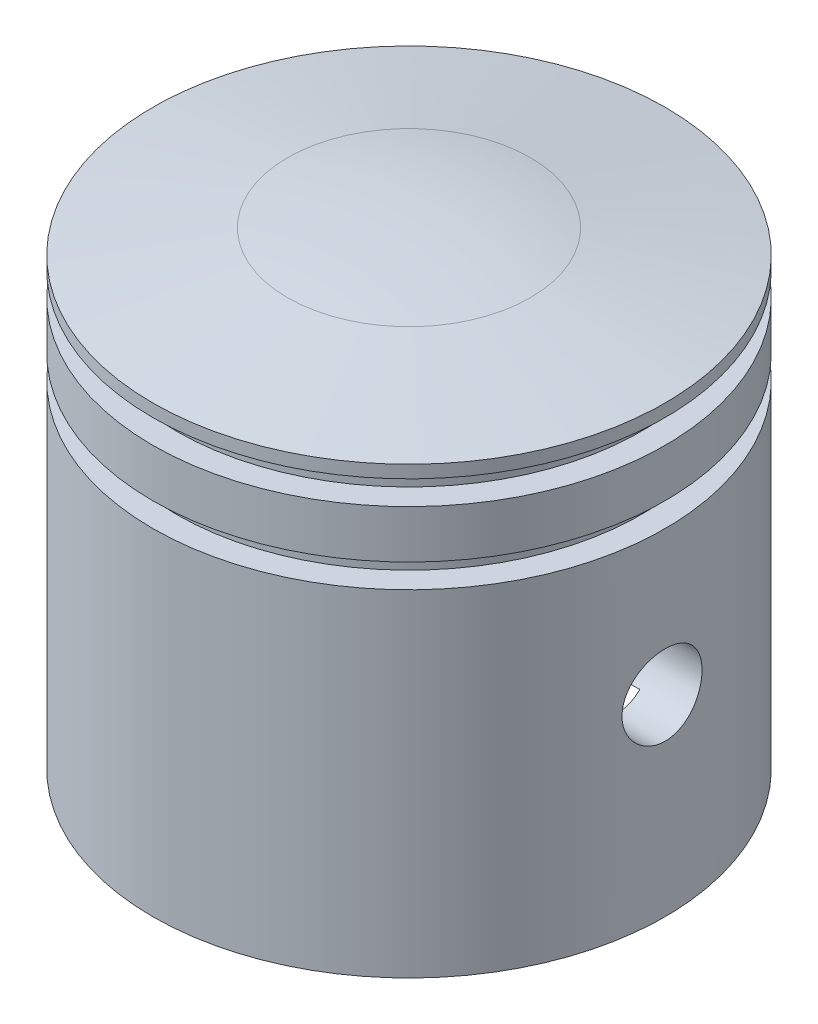
ISO-10303-21;
HEADER;
FILE_DESCRIPTION(('STEP AP214'),'2;1');
FILE_NAME('part.step','',(''),(''),'','','');
FILE_SCHEMA(('AUTOMOTIVE_DESIGN { 1 0 10303 214 1 1 1 1 }'));
ENDSEC;
DATA;
#1=APPLICATION_CONTEXT('core data for automotive mechanical design processes');
#2=APPLICATION_PROTOCOL_DEFINITION('international standard','automotive_design',2000,#1);
#3=PRODUCT_CONTEXT('',#1,'mechanical');
#4=PRODUCT('Part','Part','',(#3));
#5=PRODUCT_RELATED_PRODUCT_CATEGORY('part','',(#4));
#6=PRODUCT_DEFINITION_FORMATION('','',#4);
#7=PRODUCT_DEFINITION_CONTEXT('part definition',#1,'design');
#8=PRODUCT_DEFINITION('design','',#6,#7);
#9=PRODUCT_DEFINITION_SHAPE('','',#8);
#10=(LENGTH_UNIT() NAMED_UNIT(*) SI_UNIT(.MILLI.,.METRE.));
#11=(NAMED_UNIT(*) PLANE_ANGLE_UNIT() SI_UNIT($,.RADIAN.));
#12=(NAMED_UNIT(*) SI_UNIT($,.STERADIAN.) SOLID_ANGLE_UNIT());
#13=UNCERTAINTY_MEASURE_WITH_UNIT(LENGTH_MEASURE(1.E-05),#10,'distance_accuracy_value','');
#14=(GEOMETRIC_REPRESENTATION_CONTEXT(3) GLOBAL_UNCERTAINTY_ASSIGNED_CONTEXT((#13)) GLOBAL_UNIT_ASSIGNED_CONTEXT((#10,
#11,#12)) REPRESENTATION_CONTEXT('',''));
#15=CARTESIAN_POINT('',(0.,0.,0.));
#16=DIRECTION('',(0.,0.,1.));
#17=DIRECTION('',(1.,0.,0.));
#18=AXIS2_PLACEMENT_3D('',#15,#16,#17);
#19=CARTESIAN_POINT('',(0.,10.,0.));
#20=DIRECTION('',(0.,-1.,0.));
#21=DIRECTION('',(0.,0.,-1.));
#22=AXIS2_PLACEMENT_3D('',#19,#20,#21);
#23=PLANE('',#22);
#24=DIRECTION('',(1.,0.,0.));
#25=VECTOR('',#24,1.);
#26=CARTESIAN_POINT('',(-16.,10.,-1.5));
#27=LINE('',#26,#25);
#28=CARTESIAN_POINT('',(-12.913171570145,10.,-1.5));
#29=VERTEX_POINT('',#28);
#30=CARTESIAN_POINT('',(-9.88685996664259,10.,-1.5));
#31=VERTEX_POINT('',#30);
#32=EDGE_CURVE('E74',#29,#31,#27,.T.);
#33=ORIENTED_EDGE('',*,*,#32,.F.);
#34=CARTESIAN_POINT('',(0.,10.,0.));
#35=DIRECTION('',(0.,-1.,0.));
#36=DIRECTION('',(0.,0.,-1.));
#37=AXIS2_PLACEMENT_3D('',#34,#35,#36);
#38=CIRCLE('',#37,13.);
#39=CARTESIAN_POINT('',(12.913171570145,10.,-1.5));
#40=VERTEX_POINT('',#39);
#41=EDGE_CURVE('E277',#29,#40,#38,.T.);
#42=ORIENTED_EDGE('',*,*,#41,.T.);
#43=CARTESIAN_POINT('',(9.88685996664259,10.,-1.5));
#44=VERTEX_POINT('',#43);
#45=EDGE_CURVE('E283',#44,#40,#27,.T.);
#46=ORIENTED_EDGE('',*,*,#45,.F.);
#47=CARTESIAN_POINT('',(0.,10.,0.));
#48=DIRECTION('',(0.,-1.,0.));
#49=DIRECTION('',(0.,0.,-1.));
#50=AXIS2_PLACEMENT_3D('',#47,#48,#49);
#51=CIRCLE('',#50,10.);
#52=EDGE_CURVE('E112',#44,#31,#51,.F.);
#53=ORIENTED_EDGE('',*,*,#52,.T.);
#54=EDGE_LOOP('',(#33,#42,#46,#53));
#55=FACE_BOUND('',#54,.T.);
#56=ADVANCED_FACE('F45',(#55),#23,.T.);
#57=CARTESIAN_POINT('',(0.,30.,0.));
#58=DIRECTION('',(0.,1.,0.));
#59=DIRECTION('',(0.,0.,1.));
#60=AXIS2_PLACEMENT_3D('',#57,#58,#59);
#61=CYLINDRICAL_SURFACE('',#60,16.);
#62=CARTESIAN_POINT('',(0.,27.,0.));
#63=DIRECTION('',(0.,1.,0.));
#64=DIRECTION('',(0.,0.,1.));
#65=AXIS2_PLACEMENT_3D('',#62,#63,#64);
#66=CIRCLE('',#65,16.);
#67=CARTESIAN_POINT('',(0.,27.,16.));
#68=VERTEX_POINT('',#67);
#69=EDGE_CURVE('E244',#68,#68,#66,.T.);
#70=ORIENTED_EDGE('',*,*,#69,.T.);
#71=EDGE_LOOP('',(#70));
#72=FACE_BOUND('',#71,.T.);
#73=CARTESIAN_POINT('',(0.,27.790539738545,0.));
#74=DIRECTION('',(0.,1.,0.));
#75=DIRECTION('',(0.,0.,1.));
#76=AXIS2_PLACEMENT_3D('',#73,#74,#75);
#77=CIRCLE('',#76,16.);
#78=CARTESIAN_POINT('',(0.,27.790539738545,16.));
#79=VERTEX_POINT('',#78);
#80=EDGE_CURVE('E258',#79,#79,#77,.T.);
#81=ORIENTED_EDGE('',*,*,#80,.F.);
#82=EDGE_LOOP('',(#81));
#83=FACE_BOUND('',#82,.T.);
#84=ADVANCED_FACE('F165',(#72,#83),#61,.T.);
#85=CARTESIAN_POINT('',(0.,27.790539738545,0.));
#86=DIRECTION('',(0.,-1.,0.));
#87=DIRECTION('',(0.,0.,-1.));
#88=AXIS2_PLACEMENT_3D('',#85,#86,#87);
#89=CONICAL_SURFACE('',#88,16.,1.39626340159547);
#90=CARTESIAN_POINT('',(0.,29.275044666626,0.));
#91=DIRECTION('',(0.,1.,0.));
#92=DIRECTION('',(0.,0.,1.));
#93=AXIS2_PLACEMENT_3D('',#90,#91,#92);
#94=CIRCLE('',#93,7.58095419024099);
#95=CARTESIAN_POINT('',(0.,29.275044666626,7.58095419024099));
#96=VERTEX_POINT('',#95);
#97=EDGE_CURVE('E255',#96,#96,#94,.T.);
#98=ORIENTED_EDGE('',*,*,#97,.F.);
#99=EDGE_LOOP('',(#98));
#100=FACE_BOUND('',#99,.T.);
#101=ORIENTED_EDGE('',*,*,#80,.T.);
#102=EDGE_LOOP('',(#101));
#103=FACE_BOUND('',#102,.T.);
#104=ADVANCED_FACE('F169',(#100,#103),#89,.T.);
#105=CARTESIAN_POINT('',(0.,-10.,0.));
#106=DIRECTION('',(0.,1.,0.));
#107=DIRECTION('',(1.,0.,0.));
#108=AXIS2_PLACEMENT_3D('',#105,#106,#107);
#109=SPHERICAL_SURFACE('',#108,40.);
#110=ORIENTED_EDGE('',*,*,#97,.T.);
#111=EDGE_LOOP('',(#110));
#112=FACE_BOUND('',#111,.T.);
#113=ADVANCED_FACE('F176',(#112),#109,.T.);
#114=CARTESIAN_POINT('',(14.5,25.5,0.));
#115=DIRECTION('',(0.,-1.,0.));
#116=DIRECTION('',(0.,0.,-1.));
#117=AXIS2_PLACEMENT_3D('',#114,#115,#116);
#118=PLANE('',#117);
#119=CARTESIAN_POINT('',(0.,25.5,0.));
#120=DIRECTION('',(0.,-1.,0.));
#121=DIRECTION('',(0.,0.,-1.));
#122=AXIS2_PLACEMENT_3D('',#119,#120,#121);
#123=CIRCLE('',#122,14.5);
#124=CARTESIAN_POINT('',(0.,25.5,-14.5));
#125=VERTEX_POINT('',#124);
#126=EDGE_CURVE('E239',#125,#125,#123,.T.);
#127=ORIENTED_EDGE('',*,*,#126,.T.);
#128=EDGE_LOOP('',(#127));
#129=FACE_BOUND('',#128,.T.);
#130=CARTESIAN_POINT('',(0.,25.5,0.));
#131=DIRECTION('',(0.,-1.,0.));
#132=DIRECTION('',(0.,0.,-1.));
#133=AXIS2_PLACEMENT_3D('',#130,#131,#132);
#134=CIRCLE('',#133,16.);
#135=CARTESIAN_POINT('',(0.,25.5,-16.));
#136=VERTEX_POINT('',#135);
#137=EDGE_CURVE('E120',#136,#136,#134,.T.);
#138=ORIENTED_EDGE('',*,*,#137,.F.);
#139=EDGE_LOOP('',(#138));
#140=FACE_BOUND('',#139,.T.);
#141=ADVANCED_FACE('F180',(#129,#140),#118,.F.);
#142=CARTESIAN_POINT('',(14.5,27.,0.));
#143=DIRECTION('',(0.,1.,0.));
#144=DIRECTION('',(0.,0.,1.));
#145=AXIS2_PLACEMENT_3D('',#142,#143,#144);
#146=PLANE('',#145);
#147=CARTESIAN_POINT('',(0.,27.,0.));
#148=DIRECTION('',(0.,-1.,0.));
#149=DIRECTION('',(0.,0.,-1.));
#150=AXIS2_PLACEMENT_3D('',#147,#148,#149);
#151=CIRCLE('',#150,14.5);
#152=CARTESIAN_POINT('',(0.,27.,-14.5));
#153=VERTEX_POINT('',#152);
#154=EDGE_CURVE('E247',#153,#153,#151,.T.);
#155=ORIENTED_EDGE('',*,*,#154,.F.);
#156=EDGE_LOOP('',(#155));
#157=FACE_BOUND('',#156,.T.);
#158=ORIENTED_EDGE('',*,*,#69,.F.);
#159=EDGE_LOOP('',(#158));
#160=FACE_BOUND('',#159,.T.);
#161=ADVANCED_FACE('F197',(#157,#160),#146,.F.);
#162=CARTESIAN_POINT('',(0.,0.,0.));
#163=DIRECTION('',(0.,-1.,0.));
#164=DIRECTION('',(0.,0.,-1.));
#165=AXIS2_PLACEMENT_3D('',#162,#163,#164);
#166=CYLINDRICAL_SURFACE('',#165,14.5);
#167=ORIENTED_EDGE('',*,*,#126,.F.);
#168=EDGE_LOOP('',(#167));
#169=FACE_BOUND('',#168,.T.);
#170=ORIENTED_EDGE('',*,*,#154,.T.);
#171=EDGE_LOOP('',(#170));
#172=FACE_BOUND('',#171,.T.);
#173=ADVANCED_FACE('F194',(#169,#172),#166,.T.);
#174=ORIENTED_EDGE('',*,*,#137,.T.);
#175=EDGE_LOOP('',(#174));
#176=FACE_BOUND('',#175,.T.);
#177=CARTESIAN_POINT('',(0.,22.5,0.));
#178=DIRECTION('',(0.,1.,0.));
#179=DIRECTION('',(0.,0.,1.));
#180=AXIS2_PLACEMENT_3D('',#177,#178,#179);
#181=CIRCLE('',#180,16.);
#182=CARTESIAN_POINT('',(0.,22.5,16.));
#183=VERTEX_POINT('',#182);
#184=EDGE_CURVE('E235',#183,#183,#181,.T.);
#185=ORIENTED_EDGE('',*,*,#184,.T.);
#186=EDGE_LOOP('',(#185));
#187=FACE_BOUND('',#186,.T.);
#188=ADVANCED_FACE('F171',(#176,#187),#61,.T.);
#189=CARTESIAN_POINT('',(14.5,21.,0.));
#190=DIRECTION('',(0.,-1.,0.));
#191=DIRECTION('',(0.,0.,-1.));
#192=AXIS2_PLACEMENT_3D('',#189,#190,#191);
#193=PLANE('',#192);
#194=CARTESIAN_POINT('',(0.,21.,0.));
#195=DIRECTION('',(0.,-1.,0.));
#196=DIRECTION('',(0.,0.,-1.));
#197=AXIS2_PLACEMENT_3D('',#194,#195,#196);
#198=CIRCLE('',#197,14.5);
#199=CARTESIAN_POINT('',(0.,21.,-14.5));
#200=VERTEX_POINT('',#199);
#201=EDGE_CURVE('E264',#200,#200,#198,.T.);
#202=ORIENTED_EDGE('',*,*,#201,.T.);
#203=EDGE_LOOP('',(#202));
#204=FACE_BOUND('',#203,.T.);
#205=CARTESIAN_POINT('',(0.,21.,0.));
#206=DIRECTION('',(0.,-1.,0.));
#207=DIRECTION('',(0.,0.,-1.));
#208=AXIS2_PLACEMENT_3D('',#205,#206,#207);
#209=CIRCLE('',#208,16.);
#210=CARTESIAN_POINT('',(0.,21.,-16.));
#211=VERTEX_POINT('',#210);
#212=EDGE_CURVE('E238',#211,#211,#209,.T.);
#213=ORIENTED_EDGE('',*,*,#212,.F.);
#214=EDGE_LOOP('',(#213));
#215=FACE_BOUND('',#214,.T.);
#216=ADVANCED_FACE('F187',(#204,#215),#193,.F.);
#217=CARTESIAN_POINT('',(14.5,22.5,0.));
#218=DIRECTION('',(0.,1.,0.));
#219=DIRECTION('',(0.,0.,1.));
#220=AXIS2_PLACEMENT_3D('',#217,#218,#219);
#221=PLANE('',#220);
#222=CARTESIAN_POINT('',(0.,22.5,0.));
#223=DIRECTION('',(0.,-1.,0.));
#224=DIRECTION('',(0.,0.,-1.));
#225=AXIS2_PLACEMENT_3D('',#222,#223,#224);
#226=CIRCLE('',#225,14.5);
#227=CARTESIAN_POINT('',(0.,22.5,-14.5));
#228=VERTEX_POINT('',#227);
#229=EDGE_CURVE('E117',#228,#228,#226,.T.);
#230=ORIENTED_EDGE('',*,*,#229,.F.);
#231=EDGE_LOOP('',(#230));
#232=FACE_BOUND('',#231,.T.);
#233=ORIENTED_EDGE('',*,*,#184,.F.);
#234=EDGE_LOOP('',(#233));
#235=FACE_BOUND('',#234,.T.);
#236=ADVANCED_FACE('F185',(#232,#235),#221,.F.);
#237=CARTESIAN_POINT('',(0.,0.,0.));
#238=DIRECTION('',(0.,-1.,0.));
#239=DIRECTION('',(0.,0.,-1.));
#240=AXIS2_PLACEMENT_3D('',#237,#238,#239);
#241=CYLINDRICAL_SURFACE('',#240,14.5);
#242=ORIENTED_EDGE('',*,*,#201,.F.);
#243=EDGE_LOOP('',(#242));
#244=FACE_BOUND('',#243,.T.);
#245=ORIENTED_EDGE('',*,*,#229,.T.);
#246=EDGE_LOOP('',(#245));
#247=FACE_BOUND('',#246,.T.);
#248=ADVANCED_FACE('F182',(#244,#247),#241,.T.);
#249=CARTESIAN_POINT('',(0.,0.,0.));
#250=DIRECTION('',(0.,1.,0.));
#251=DIRECTION('',(0.,0.,1.));
#252=AXIS2_PLACEMENT_3D('',#249,#250,#251);
#253=PLANE('',#252);
#254=CARTESIAN_POINT('',(0.,0.,0.));
#255=DIRECTION('',(0.,-1.,0.));
#256=DIRECTION('',(0.,0.,-1.));
#257=AXIS2_PLACEMENT_3D('',#254,#255,#256);
#258=CIRCLE('',#257,13.);
#259=CARTESIAN_POINT('',(0.,0.,-13.));
#260=VERTEX_POINT('',#259);
#261=EDGE_CURVE('E274',#260,#260,#258,.T.);
#262=ORIENTED_EDGE('',*,*,#261,.F.);
#263=EDGE_LOOP('',(#262));
#264=FACE_BOUND('',#263,.T.);
#265=CARTESIAN_POINT('',(0.,0.,0.));
#266=DIRECTION('',(0.,1.,0.));
#267=DIRECTION('',(0.,0.,1.));
#268=AXIS2_PLACEMENT_3D('',#265,#266,#267);
#269=CIRCLE('',#268,16.);
#270=CARTESIAN_POINT('',(0.,0.,16.));
#271=VERTEX_POINT('',#270);
#272=EDGE_CURVE('E99',#271,#271,#269,.T.);
#273=ORIENTED_EDGE('',*,*,#272,.F.);
#274=EDGE_LOOP('',(#273));
#275=FACE_BOUND('',#274,.T.);
#276=ADVANCED_FACE('F47',(#264,#275),#253,.F.);
#277=CARTESIAN_POINT('',(-16.,14.5,0.));
#278=CARTESIAN_POINT('',(-15.9999977019448,14.4999943017285,0.139515097271033));
#279=CARTESIAN_POINT('',(-15.9981561248574,14.4882818862264,0.279109404865704));
#280=CARTESIAN_POINT('',(-15.9909869809759,14.4417563087232,0.554391314978102));
#281=CARTESIAN_POINT('',(-15.9856560884472,14.4069211074965,0.690075061323317));
#282=CARTESIAN_POINT('',(-15.9721069716578,14.3152203371934,0.953512538047404));
#283=CARTESIAN_POINT('',(-15.9638909956317,14.2583719186384,1.0812723522899));
#284=CARTESIAN_POINT('',(-15.9454779403815,14.1243014548584,1.3254212510446));
#285=CARTESIAN_POINT('',(-15.9352811186255,14.0470820569641,1.44181181036831));
#286=CARTESIAN_POINT('',(-15.9139426841436,13.873766951646,1.66091991165162));
#287=CARTESIAN_POINT('',(-15.9027945139234,13.7775330051098,1.76352747914264));
#288=CARTESIAN_POINT('',(-15.8808607613029,13.5692180517311,1.95120768822823));
#289=CARTESIAN_POINT('',(-15.8700752005075,13.4571361026998,2.03627928654192));
#290=CARTESIAN_POINT('',(-15.8500242812744,13.2195617286563,2.18690544328884));
#291=CARTESIAN_POINT('',(-15.840767397861,13.0940005176382,2.25235273557992));
#292=CARTESIAN_POINT('',(-15.8249120174236,12.8334985891422,2.36118681597065));
#293=CARTESIAN_POINT('',(-15.8183133630222,12.6985584274894,2.40457491010063));
#294=CARTESIAN_POINT('',(-15.8085863451104,12.4242890988562,2.46771559322167));
#295=CARTESIAN_POINT('',(-15.8054302653236,12.2850044141812,2.48765705487496));
#296=CARTESIAN_POINT('',(-15.8028617107177,12.0050328111074,2.50392369757622));
#297=CARTESIAN_POINT('',(-15.8034490028802,11.864345980534,2.50025034860466));
#298=CARTESIAN_POINT('',(-15.8082755045521,11.5869029681473,2.4695458080889));
#299=CARTESIAN_POINT('',(-15.8124817218495,11.4501227766469,2.44272562959693));
#300=CARTESIAN_POINT('',(-15.8240205634547,11.1830279936407,2.36681937833752));
#301=CARTESIAN_POINT('',(-15.8313532830641,11.0527135993595,2.31773262684132));
#302=CARTESIAN_POINT('',(-15.8483550685462,10.8016112873228,2.19846916949384));
#303=CARTESIAN_POINT('',(-15.8580339308724,10.6808662082269,2.12820372315549));
#304=CARTESIAN_POINT('',(-15.878630461501,10.4528004643145,1.96864058146637));
#305=CARTESIAN_POINT('',(-15.8895482178821,10.3454807551125,1.87934153253017));
#306=CARTESIAN_POINT('',(-15.911537862489,10.1460897533667,1.68309088822333));
#307=CARTESIAN_POINT('',(-15.9226101363559,10.0541968417305,1.57595800560539));
#308=CARTESIAN_POINT('',(-15.9435512534783,9.8896668543601,1.34769694737936));
#309=CARTESIAN_POINT('',(-15.9534200906202,9.81702987644317,1.22656870068132));
#310=CARTESIAN_POINT('',(-15.9708539902704,9.69306192657761,0.973595927056491));
#311=CARTESIAN_POINT('',(-15.9784174854193,9.641745441467,0.841744186240459));
#312=CARTESIAN_POINT('',(-15.9903756000068,9.56203403255277,0.571149534696758));
#313=CARTESIAN_POINT('',(-15.9947704520898,9.53363742593352,0.4324071306872));
#314=CARTESIAN_POINT('',(-15.9998651172728,9.50081072354981,0.153508336763735));
#315=CARTESIAN_POINT('',(-16.0006027179286,9.49613552102382,0.013381461508702));
#316=CARTESIAN_POINT('',(-15.9984028649127,9.51023270533598,-0.265654546411642));
#317=CARTESIAN_POINT('',(-15.9954655349964,9.52900430258911,-0.404563719925156));
#318=CARTESIAN_POINT('',(-15.9862692369322,9.58925838768018,-0.676473446265705));
#319=CARTESIAN_POINT('',(-15.9800278421539,9.63062075826773,-0.809501262056041));
#320=CARTESIAN_POINT('',(-15.9649207568356,9.73475509439879,-1.06673406785663));
#321=CARTESIAN_POINT('',(-15.9560549341007,9.79752813844267,-1.19093861303941));
#322=CARTESIAN_POINT('',(-15.9365897274094,9.94327199112658,-1.42807220225041));
#323=CARTESIAN_POINT('',(-15.9259772866342,10.0263974200905,-1.54090512378373));
#324=CARTESIAN_POINT('',(-15.9042388046444,10.2102720859078,-1.75110696507806));
#325=CARTESIAN_POINT('',(-15.8931127309268,10.3110224392049,-1.84847490447018));
#326=CARTESIAN_POINT('',(-15.8714802753665,10.5283811972172,-2.02588080776691));
#327=CARTESIAN_POINT('',(-15.860980411908,10.6451248471223,-2.10575398584126));
#328=CARTESIAN_POINT('',(-15.8419069280583,10.8905160736613,-2.2447556772664));
#329=CARTESIAN_POINT('',(-15.83333325222,11.0191633074895,-2.30388478778105));
#330=CARTESIAN_POINT('',(-15.8191307135236,11.2842296407142,-2.39946771944995));
#331=CARTESIAN_POINT('',(-15.8134908234896,11.4206174687656,-2.43600654947912));
#332=CARTESIAN_POINT('',(-15.8057657028079,11.697689143664,-2.48564122040535));
#333=CARTESIAN_POINT('',(-15.8036802038444,11.838372665419,-2.49873883084997));
#334=CARTESIAN_POINT('',(-15.8033105804488,12.1183987159075,-2.50107452690756));
#335=CARTESIAN_POINT('',(-15.804985160429,12.2577390969335,-2.49057180548425));
#336=CARTESIAN_POINT('',(-15.8118569894183,12.5326452971443,-2.44656223255901));
#337=CARTESIAN_POINT('',(-15.8170542307995,12.6682111245017,-2.41305543086961));
#338=CARTESIAN_POINT('',(-15.830370888549,12.9316378266405,-2.32408329891852));
#339=CARTESIAN_POINT('',(-15.8384876895341,13.0595054782584,-2.26863761738581));
#340=CARTESIAN_POINT('',(-15.856731840474,13.3041656136763,-2.13738768546417));
#341=CARTESIAN_POINT('',(-15.8668592701083,13.4209576582884,-2.06158262820886));
#342=CARTESIAN_POINT('',(-15.8881156809226,13.6414655441268,-1.8908300813908));
#343=CARTESIAN_POINT('',(-15.8992540116029,13.7450321966138,-1.79569107094768));
#344=CARTESIAN_POINT('',(-15.9212004364073,13.9348212363867,-1.58937594638204));
#345=CARTESIAN_POINT('',(-15.9320084534012,14.0210395985919,-1.47819612078432));
#346=CARTESIAN_POINT('',(-15.952151024567,14.1741512230316,-1.24216685884341));
#347=CARTESIAN_POINT('',(-15.9614763443027,14.2409253727596,-1.11723937214238));
#348=CARTESIAN_POINT('',(-15.9775125983888,14.3524409961929,-0.857851882357784));
#349=CARTESIAN_POINT('',(-15.9842262014212,14.3972049725584,-0.723401776581762));
#350=CARTESIAN_POINT('',(-15.9927744586488,14.4534330210906,-0.490314239911593));
#351=CARTESIAN_POINT('',(-15.9954699162612,14.470868490629,-0.393105575651624));
#352=CARTESIAN_POINT('',(-15.9990834869762,14.4941539133791,-0.197277797850582));
#353=CARTESIAN_POINT('',(-16.0000016250796,14.5000040295573,-0.0986587041691184));
#354=CARTESIAN_POINT('',(-16.,14.5,0.));
#355=B_SPLINE_CURVE_WITH_KNOTS('',3,(#277,#278,#279,#280,#281,#282,#283,#284,#285,#286,#287,
#288,#289,#290,#291,#292,#293,#294,#295,#296,#297,#298,#299,#300,#301,#302,#303,#304,#305,#306,
#307,#308,#309,#310,#311,#312,#313,#314,#315,#316,#317,#318,#319,#320,#321,#322,#323,#324,#325,
#326,#327,#328,#329,#330,#331,#332,#333,#334,#335,#336,#337,#338,#339,#340,#341,#342,#343,#344,
#345,#346,#347,#348,#349,#350,#351,#352,#353,#354),.UNSPECIFIED.,.T.,.F.,(4,2,2,2,2,2,2,2,2,2,2,
2,2,2,2,2,2,2,2,2,2,2,2,2,2,2,2,2,2,2,2,2,2,2,2,2,2,2,4),(0.,0.418184740477491,
0.836768642528014,1.25502707944103,1.6732311879203,2.09459568152199,2.51598523645422,
2.93963778605759,3.36326525009238,3.78345631134994,4.20362121670545,4.6199957602258,
5.0363829965105,5.45453977402347,5.87272629892069,6.29545732334367,6.71819049513827,
7.14121043754565,7.56419931829866,7.98280854005914,8.40140366528356,8.81779444756567,
9.23420620742031,9.65388541469672,10.0735912160142,10.4970948024959,10.9205861964898,
11.3424741039513,11.764330162293,12.1815758159869,12.598820566189,13.0156924696662,
13.4325808967135,13.8538201231554,14.275156971423,14.6990230419984,15.1224548565628,
15.4181801635154,15.7139013105871),.UNSPECIFIED.);
#356=CARTESIAN_POINT('',(-16.,14.5,0.));
#357=VERTEX_POINT('',#356);
#358=EDGE_CURVE('E160',#357,#357,#355,.T.);
#359=ORIENTED_EDGE('',*,*,#358,.T.);
#360=EDGE_LOOP('',(#359));
#361=FACE_BOUND('',#360,.T.);
#362=CARTESIAN_POINT('',(15.8034806292791,12.,-2.5));
#363=CARTESIAN_POINT('',(15.8034830346332,11.860496621659,-2.49999429179104));
#364=CARTESIAN_POINT('',(15.8053478026579,11.7209140023147,-2.48828377742084));
#365=CARTESIAN_POINT('',(15.8125997089632,11.4456563709971,-2.44176643645043));
#366=CARTESIAN_POINT('',(15.8179902148259,11.3099852245206,-2.40693752801736));
#367=CARTESIAN_POINT('',(15.8316684916183,11.0465744103556,-2.31525516047132));
#368=CARTESIAN_POINT('',(15.8399539668268,10.9188285521292,-2.25841914921922));
#369=CARTESIAN_POINT('',(15.8584858981599,10.6747031091579,-2.12437791816389));
#370=CARTESIAN_POINT('',(15.8687321022282,10.5583220663405,-2.04717531605122));
#371=CARTESIAN_POINT('',(15.8901303851737,10.3392035148487,-1.87387730110911));
#372=CARTESIAN_POINT('',(15.9012888784461,10.2365789256004,-1.777639886175));
#373=CARTESIAN_POINT('',(15.9231973082665,10.0488657795701,-1.56931080987672));
#374=CARTESIAN_POINT('',(15.9339472216983,9.96377821377571,-1.45721825316848));
#375=CARTESIAN_POINT('',(15.9538946715316,9.81313512295885,-1.21963429185761));
#376=CARTESIAN_POINT('',(15.9630838016344,9.74768399602554,-1.09407592635729));
#377=CARTESIAN_POINT('',(15.978803149105,9.63884204527492,-0.833580171794756));
#378=CARTESIAN_POINT('',(15.9853335186778,9.59544995861733,-0.698643320136811));
#379=CARTESIAN_POINT('',(15.9949542857973,9.53230128104384,-0.424385325448812));
#380=CARTESIAN_POINT('',(15.9980722260505,9.51235535093165,-0.285108760160752));
#381=CARTESIAN_POINT('',(16.0006113098095,9.49607695669663,-0.00515314355067117));
#382=CARTESIAN_POINT('',(16.0000326754547,9.49974307364815,0.135525822989186));
#383=CARTESIAN_POINT('',(15.9952657389868,9.53043592627786,0.413000089722151));
#384=CARTESIAN_POINT('',(15.9911089169598,9.55725893884032,0.549818542575174));
#385=CARTESIAN_POINT('',(15.9796877395528,9.63318402862262,0.816988375343491));
#386=CARTESIAN_POINT('',(15.9724232987387,9.68228671835413,0.947339577352174));
#387=CARTESIAN_POINT('',(15.9555491842028,9.80158365586005,1.19848742679247));
#388=CARTESIAN_POINT('',(15.9459300777042,9.87186300542795,1.31924299071837));
#389=CARTESIAN_POINT('',(15.9254174702046,10.0314560806292,1.54732385653213));
#390=CARTESIAN_POINT('',(15.9145238783282,10.120771163955,1.65464819959324));
#391=CARTESIAN_POINT('',(15.8925387825556,10.3170334870733,1.85402198520023));
#392=CARTESIAN_POINT('',(15.8814464071021,10.4241586663949,1.94589625613075));
#393=CARTESIAN_POINT('',(15.8604269384475,10.6523975646821,2.11039226047485));
#394=CARTESIAN_POINT('',(15.8504998536298,10.7735113842741,2.18301385538335));
#395=CARTESIAN_POINT('',(15.8329349281613,11.0264796281058,2.30697060635685));
#396=CARTESIAN_POINT('',(15.8252991458489,11.1583435750735,2.35828663884161));
#397=CARTESIAN_POINT('',(15.8132168990948,11.4289648487055,2.43799343127668));
#398=CARTESIAN_POINT('',(15.8087701897074,11.5677216450697,2.46638595195258));
#399=CARTESIAN_POINT('',(15.8036163696886,11.8466281032752,2.49919719237856));
#400=CARTESIAN_POINT('',(15.80287044806,11.9867478001948,2.50386473411271));
#401=CARTESIAN_POINT('',(15.8050994977182,12.2657676352979,2.48975479033184));
#402=CARTESIAN_POINT('',(15.8080743433524,12.4046678145059,2.47097809654328));
#403=CARTESIAN_POINT('',(15.8173740105186,12.6765278074665,2.41072412555896));
#404=CARTESIAN_POINT('',(15.8236803883335,12.8095159986396,2.36937178781979));
#405=CARTESIAN_POINT('',(15.8389172439685,13.0666739711039,2.26527072241932));
#406=CARTESIAN_POINT('',(15.8478478614411,13.190843282649,2.20252085602949));
#407=CARTESIAN_POINT('',(15.8674179220711,13.4279512816488,2.05681199170293));
#408=CARTESIAN_POINT('',(15.8780706945976,13.5407902289,1.97369251093471));
#409=CARTESIAN_POINT('',(15.8998450469621,13.7510069808482,1.78982593995283));
#410=CARTESIAN_POINT('',(15.9109666556111,13.848383833607,1.6890777652142));
#411=CARTESIAN_POINT('',(15.9325473887455,14.0258112706355,1.47171546765808));
#412=CARTESIAN_POINT('',(15.9429995842164,14.1056965764301,1.35496564158984));
#413=CARTESIAN_POINT('',(15.9619548934084,14.2447195199902,1.10955861029337));
#414=CARTESIAN_POINT('',(15.9704580640831,14.3038577640459,0.980901753162492));
#415=CARTESIAN_POINT('',(15.9845269767683,14.3994462752842,0.715839663778327));
#416=CARTESIAN_POINT('',(15.9901042225572,14.4359854974394,0.579467147617089));
#417=CARTESIAN_POINT('',(15.9977412978946,14.4856261326728,0.302427949770746));
#418=CARTESIAN_POINT('',(15.9998013804089,14.498729231356,0.161761577654431));
#419=CARTESIAN_POINT('',(16.0001691012796,14.5010818526552,-0.118272165188271));
#420=CARTESIAN_POINT('',(15.9985164403994,14.4905837446428,-0.257637428859786));
#421=CARTESIAN_POINT('',(15.9917247801431,14.4465746838196,-0.532594595464882));
#422=CARTESIAN_POINT('',(15.9865857947973,14.4130638236216,-0.668186513581641));
#423=CARTESIAN_POINT('',(15.9733964142131,14.3240727402876,-0.931668850429401));
#424=CARTESIAN_POINT('',(15.965348528289,14.2686114484191,-1.05956579651625));
#425=CARTESIAN_POINT('',(15.947223323121,14.137321161478,-1.30427807253219));
#426=CARTESIAN_POINT('',(15.9371459268214,14.0614913930258,-1.42109298145458));
#427=CARTESIAN_POINT('',(15.9159528222148,13.8907105567916,-1.64160219185804));
#428=CARTESIAN_POINT('',(15.9048276353277,13.795573685696,-1.745151694824));
#429=CARTESIAN_POINT('',(15.8828612878644,13.5892700426646,-1.93490712736947));
#430=CARTESIAN_POINT('',(15.8720201944801,13.4780995182753,-2.02110898563013));
#431=CARTESIAN_POINT('',(15.8517779742959,13.2420788957246,-2.17420151541622));
#432=CARTESIAN_POINT('',(15.842386091806,13.1171490413903,-2.24097044145097));
#433=CARTESIAN_POINT('',(15.8262143333515,12.85775678237,-2.35247565604314));
#434=CARTESIAN_POINT('',(15.8194317848938,12.7233042988834,-2.3972345005847));
#435=CARTESIAN_POINT('',(15.8107909670081,12.4902302603036,-2.45344906957713));
#436=CARTESIAN_POINT('',(15.8080643798014,12.3930384000151,-2.47087849275467));
#437=CARTESIAN_POINT('',(15.804408373768,12.1972442189536,-2.49415589078729));
#438=CARTESIAN_POINT('',(15.8034789284691,12.0986419189782,-2.50000403623692));
#439=CARTESIAN_POINT('',(15.8034806292791,12.,-2.5));
#440=B_SPLINE_CURVE_WITH_KNOTS('',3,(#362,#363,#364,#365,#366,#367,#368,#369,#370,#371,#372,
#373,#374,#375,#376,#377,#378,#379,#380,#381,#382,#383,#384,#385,#386,#387,#388,#389,#390,#391,
#392,#393,#394,#395,#396,#397,#398,#399,#400,#401,#402,#403,#404,#405,#406,#407,#408,#409,#410,
#411,#412,#413,#414,#415,#416,#417,#418,#419,#420,#421,#422,#423,#424,#425,#426,#427,#428,#429,
#430,#431,#432,#433,#434,#435,#436,#437,#438,#439),.UNSPECIFIED.,.T.,.F.,(4,2,2,2,2,2,2,2,2,2,2,
2,2,2,2,2,2,2,2,2,2,2,2,2,2,2,2,2,2,2,2,2,2,2,2,2,2,2,4),(0.,0.418149527902241,
0.836699032574077,1.25491737645053,1.67308199345223,2.09449258051085,2.51592697424482,
2.93956378022295,3.36317633102573,3.78334397517517,4.20348637030326,4.61996979150785,
5.03646466334576,5.45465612930833,5.87287743207563,6.29556043395287,6.71824647655855,
7.14131110038651,7.56434322607052,7.98292940034458,8.40150143908463,8.81778013452042,
9.23408098683358,9.65377352836981,10.0734918986585,10.4970197199928,10.9205351635679,
11.3423727623224,11.7641800198745,12.18149834073,12.5988149821383,13.0157724881518,
13.432745828047,13.8539404040181,14.275233715164,14.6991122166338,15.1225554163993,
15.4182305458031,15.7139013198205),.UNSPECIFIED.);
#441=CARTESIAN_POINT('',(15.8034806292791,12.,-2.5));
#442=VERTEX_POINT('',#441);
#443=EDGE_CURVE('E154',#442,#442,#440,.T.);
#444=ORIENTED_EDGE('',*,*,#443,.T.);
#445=EDGE_LOOP('',(#444));
#446=FACE_BOUND('',#445,.T.);
#447=ORIENTED_EDGE('',*,*,#212,.T.);
#448=EDGE_LOOP('',(#447));
#449=FACE_BOUND('',#448,.T.);
#450=ORIENTED_EDGE('',*,*,#272,.T.);
#451=EDGE_LOOP('',(#450));
#452=FACE_BOUND('',#451,.T.);
#453=ADVANCED_FACE('F172',(#361,#446,#449,#452),#61,.T.);
#454=DIRECTION('',(1.,0.,0.));
#455=VECTOR('',#454,1.);
#456=CARTESIAN_POINT('',(-16.,10.,1.5));
#457=LINE('',#456,#455);
#458=CARTESIAN_POINT('',(12.913171570145,10.,1.5));
#459=VERTEX_POINT('',#458);
#460=CARTESIAN_POINT('',(9.88685996664259,10.,1.5));
#461=VERTEX_POINT('',#460);
#462=EDGE_CURVE('E67',#459,#461,#457,.F.);
#463=ORIENTED_EDGE('',*,*,#462,.F.);
#464=CARTESIAN_POINT('',(-12.913171570145,10.,1.5));
#465=VERTEX_POINT('',#464);
#466=EDGE_CURVE('E106',#459,#465,#38,.T.);
#467=ORIENTED_EDGE('',*,*,#466,.T.);
#468=CARTESIAN_POINT('',(-9.88685996664259,10.,1.5));
#469=VERTEX_POINT('',#468);
#470=EDGE_CURVE('E92',#469,#465,#457,.F.);
#471=ORIENTED_EDGE('',*,*,#470,.F.);
#472=EDGE_CURVE('E104',#469,#461,#51,.F.);
#473=ORIENTED_EDGE('',*,*,#472,.T.);
#474=EDGE_LOOP('',(#463,#467,#471,#473));
#475=FACE_BOUND('',#474,.T.);
#476=ADVANCED_FACE('F103',(#475),#23,.T.);
#477=CARTESIAN_POINT('',(0.,10.,0.));
#478=DIRECTION('',(0.,-1.,0.));
#479=DIRECTION('',(0.,0.,-1.));
#480=AXIS2_PLACEMENT_3D('',#477,#478,#479);
#481=CYLINDRICAL_SURFACE('',#480,13.);
#482=ORIENTED_EDGE('',*,*,#41,.F.);
#483=CARTESIAN_POINT('',(-12.913171570145,10.,-1.5));
#484=CARTESIAN_POINT('',(-12.9196464939997,9.95820085358915,-1.44426579878659));
#485=CARTESIAN_POINT('',(-12.9259549192278,9.91874092086907,-1.38679796540747));
#486=CARTESIAN_POINT('',(-12.9380773902685,9.84473133764257,-1.26873073828123));
#487=CARTESIAN_POINT('',(-12.9438914163828,9.81018188274731,-1.20813121991303));
#488=CARTESIAN_POINT('',(-12.9603404608392,9.71430178140072,-1.02224257355282));
#489=CARTESIAN_POINT('',(-12.9699930765876,9.66067330241013,-0.892775127826518));
#490=CARTESIAN_POINT('',(-12.9855839172602,9.57571702553779,-0.626442746105629));
#491=CARTESIAN_POINT('',(-12.9915189085937,9.54440863841842,-0.489571482352221));
#492=CARTESIAN_POINT('',(-12.9990013032835,9.50512260914373,-0.212467802603064));
#493=CARTESIAN_POINT('',(-13.0005515461425,9.49712986799228,-0.0722376211678123));
#494=CARTESIAN_POINT('',(-12.9991042541622,9.50466026890764,0.206029683769606));
#495=CARTESIAN_POINT('',(-12.996155887224,9.51992916830979,0.344074092382287));
#496=CARTESIAN_POINT('',(-12.986125153176,9.57304239783094,0.615650842540818));
#497=CARTESIAN_POINT('',(-12.9790411747057,9.61089552758196,0.749181403888349));
#498=CARTESIAN_POINT('',(-12.9627490398878,9.70119099514041,0.989738928879762));
#499=CARTESIAN_POINT('',(-12.9539797808047,9.75083257474323,1.09785208331175));
#500=CARTESIAN_POINT('',(-12.9395107443663,9.83627154609569,1.25371177293855));
#501=CARTESIAN_POINT('',(-12.9344702910731,9.86656964555138,1.30459866498264));
#502=CARTESIAN_POINT('',(-12.9240502172861,9.9306832908871,1.4040757561164));
#503=CARTESIAN_POINT('',(-12.9186705698196,9.96449911663509,1.45266577202019));
#504=CARTESIAN_POINT('',(-12.913171570145,10.,1.5));
#505=B_SPLINE_CURVE_WITH_KNOTS('',3,(#483,#484,#485,#486,#487,#488,#489,#490,#491,#492,#493,
#494,#495,#496,#497,#498,#499,#500,#501,#502,#503,#504),.UNSPECIFIED.,.F.,.F.,(4,2,2,2,2,2,2,2,
2,2,4),(0.,0.209776062140149,0.419560478466375,0.838801230764256,1.25840613426738,
1.67773924513587,2.09252194041192,2.50746635565219,2.86404950501363,3.04223164009906,
3.22042796209395),.UNSPECIFIED.);
#506=EDGE_CURVE('E141',#29,#465,#505,.T.);
#507=ORIENTED_EDGE('',*,*,#506,.T.);
#508=ORIENTED_EDGE('',*,*,#466,.F.);
#509=CARTESIAN_POINT('',(12.913171570145,10.,1.5));
#510=CARTESIAN_POINT('',(12.9196464939997,9.95820085358915,1.44426579878659));
#511=CARTESIAN_POINT('',(12.9259549192278,9.91874092086907,1.38679796540747));
#512=CARTESIAN_POINT('',(12.9380773902685,9.84473133764257,1.26873073828123));
#513=CARTESIAN_POINT('',(12.9438914163828,9.81018188274731,1.20813121991303));
#514=CARTESIAN_POINT('',(12.9603404608392,9.71430178140072,1.02224257355282));
#515=CARTESIAN_POINT('',(12.9699930765876,9.66067330241013,0.892775127826518));
#516=CARTESIAN_POINT('',(12.9855839172602,9.57571702553779,0.626442746105629));
#517=CARTESIAN_POINT('',(12.9915189085937,9.54440863841842,0.489571482352221));
#518=CARTESIAN_POINT('',(12.9990013032835,9.50512260914373,0.212467802603064));
#519=CARTESIAN_POINT('',(13.0005515461425,9.49712986799228,0.0722376211678123));
#520=CARTESIAN_POINT('',(12.9991042541622,9.50466026890764,-0.206029683769606));
#521=CARTESIAN_POINT('',(12.996155887224,9.51992916830979,-0.344074092382287));
#522=CARTESIAN_POINT('',(12.986125153176,9.57304239783094,-0.615650842540818));
#523=CARTESIAN_POINT('',(12.9790411747057,9.61089552758196,-0.749181403888349));
#524=CARTESIAN_POINT('',(12.9627490398878,9.70119099514041,-0.989738928879762));
#525=CARTESIAN_POINT('',(12.9539797808047,9.75083257474323,-1.09785208331175));
#526=CARTESIAN_POINT('',(12.9395107443663,9.83627154609569,-1.25371177293855));
#527=CARTESIAN_POINT('',(12.9344702910731,9.86656964555138,-1.30459866498264));
#528=CARTESIAN_POINT('',(12.9240502172861,9.9306832908871,-1.4040757561164));
#529=CARTESIAN_POINT('',(12.9186705698196,9.96449911663509,-1.45266577202019));
#530=CARTESIAN_POINT('',(12.913171570145,10.,-1.5));
#531=B_SPLINE_CURVE_WITH_KNOTS('',3,(#509,#510,#511,#512,#513,#514,#515,#516,#517,#518,#519,
#520,#521,#522,#523,#524,#525,#526,#527,#528,#529,#530),.UNSPECIFIED.,.F.,.F.,(4,2,2,2,2,2,2,2,
2,2,4),(0.,0.209776062140149,0.419560478466375,0.838801230764256,1.25840613426738,
1.67773924513587,2.09252194041192,2.50746635565219,2.86404950501363,3.04223164009906,
3.22042796209395),.UNSPECIFIED.);
#532=EDGE_CURVE('E148',#459,#40,#531,.T.);
#533=ORIENTED_EDGE('',*,*,#532,.T.);
#534=EDGE_LOOP('',(#482,#507,#508,#533));
#535=FACE_BOUND('',#534,.T.);
#536=ORIENTED_EDGE('',*,*,#261,.T.);
#537=EDGE_LOOP('',(#536));
#538=FACE_BOUND('',#537,.T.);
#539=ADVANCED_FACE('F212',(#535,#538),#481,.F.);
#540=CARTESIAN_POINT('',(0.,24.,0.));
#541=DIRECTION('',(0.,-1.,0.));
#542=DIRECTION('',(0.,0.,-1.));
#543=AXIS2_PLACEMENT_3D('',#540,#541,#542);
#544=PLANE('',#543);
#545=CARTESIAN_POINT('',(0.,24.,0.));
#546=DIRECTION('',(0.,-1.,0.));
#547=DIRECTION('',(0.,0.,-1.));
#548=AXIS2_PLACEMENT_3D('',#545,#546,#547);
#549=CIRCLE('',#548,10.);
#550=CARTESIAN_POINT('',(0.,24.,-10.));
#551=VERTEX_POINT('',#550);
#552=EDGE_CURVE('E111',#551,#551,#549,.T.);
#553=ORIENTED_EDGE('',*,*,#552,.T.);
#554=EDGE_LOOP('',(#553));
#555=FACE_BOUND('',#554,.T.);
#556=ADVANCED_FACE('F217',(#555),#544,.T.);
#557=CARTESIAN_POINT('',(0.,24.,0.));
#558=DIRECTION('',(0.,-1.,0.));
#559=DIRECTION('',(0.,0.,-1.));
#560=AXIS2_PLACEMENT_3D('',#557,#558,#559);
#561=CYLINDRICAL_SURFACE('',#560,10.);
#562=ORIENTED_EDGE('',*,*,#552,.F.);
#563=EDGE_LOOP('',(#562));
#564=FACE_BOUND('',#563,.T.);
#565=ORIENTED_EDGE('',*,*,#52,.F.);
#566=CARTESIAN_POINT('',(9.88685996664259,10.,-1.5));
#567=CARTESIAN_POINT('',(9.87829702632978,10.0423381044855,-1.55644775774642));
#568=CARTESIAN_POINT('',(9.8695164098382,10.0870272455987,-1.61105469283506));
#569=CARTESIAN_POINT('',(9.85176215376839,10.1808382203519,-1.71628235343695));
#570=CARTESIAN_POINT('',(9.84278851814074,10.2299599633339,-1.76690316043694));
#571=CARTESIAN_POINT('',(9.8159502550057,10.3835199248386,-1.91228287155091));
#572=CARTESIAN_POINT('',(9.79815893076327,10.4941971430423,-2.00061796766923));
#573=CARTESIAN_POINT('',(9.76481433608198,10.7291280421412,-2.15751587055995));
#574=CARTESIAN_POINT('',(9.74926267017561,10.8533913453404,-2.22606453693198));
#575=CARTESIAN_POINT('',(9.72224025261607,11.1120506879739,-2.34127318968291));
#576=CARTESIAN_POINT('',(9.7107671007491,11.246440711182,-2.38794605518357));
#577=CARTESIAN_POINT('',(9.6934351616116,11.5194319951237,-2.45735418339059));
#578=CARTESIAN_POINT('',(9.6874935617474,11.6579379985205,-2.48044304897375));
#579=CARTESIAN_POINT('',(9.68165898643259,11.937005984586,-2.50312290551809));
#580=CARTESIAN_POINT('',(9.68176622057743,12.0775680383293,-2.50271308223672));
#581=CARTESIAN_POINT('',(9.68793593914431,12.3529816746888,-2.47871632829885));
#582=CARTESIAN_POINT('',(9.69384866853871,12.4878879868879,-2.45571222118534));
#583=CARTESIAN_POINT('',(9.71071117534564,12.7518469398539,-2.38815579017542));
#584=CARTESIAN_POINT('',(9.72166092471398,12.8808996132072,-2.34360358625042));
#585=CARTESIAN_POINT('',(9.74746560596719,13.1307885670213,-2.23385335557449));
#586=CARTESIAN_POINT('',(9.7623529195144,13.2515457436194,-2.16848317197037));
#587=CARTESIAN_POINT('',(9.79434578612789,13.4805714327983,-2.01906213967446));
#588=CARTESIAN_POINT('',(9.81145177041249,13.5888375098736,-1.93500765725064));
#589=CARTESIAN_POINT('',(9.84655716119831,13.7930738176455,-1.74774822886379));
#590=CARTESIAN_POINT('',(9.86456812118589,13.8886024628581,-1.64406327335133));
#591=CARTESIAN_POINT('',(9.89902179366731,14.0610160403167,-1.42196244073076));
#592=CARTESIAN_POINT('',(9.91546444768792,14.1379002775831,-1.30354601474861));
#593=CARTESIAN_POINT('',(9.94504061645413,14.2711428922548,-1.05449104713443));
#594=CARTESIAN_POINT('',(9.95815689068242,14.3273949788563,-0.923793454785755));
#595=CARTESIAN_POINT('',(9.97947886085677,14.4170037555349,-0.654395587270723));
#596=CARTESIAN_POINT('',(9.98768547304251,14.4503647177176,-0.515696810583525));
#597=CARTESIAN_POINT('',(9.99811008554861,14.492511399187,-0.237953144489439));
#598=CARTESIAN_POINT('',(10.000472783337,14.5018911060145,-0.0990037399750364));
#599=CARTESIAN_POINT('',(9.99936924845989,14.4974769837093,0.178494017362685));
#600=CARTESIAN_POINT('',(9.9959035931882,14.4836854500677,0.317042408550894));
#601=CARTESIAN_POINT('',(9.98363158834437,14.4338166174374,0.587489627768107));
#602=CARTESIAN_POINT('',(9.97491213094045,14.398101730266,0.719459604109864));
#603=CARTESIAN_POINT('',(9.95313476079063,14.3058384175761,0.975517412390961));
#604=CARTESIAN_POINT('',(9.94007644385454,14.2492880510571,1.09960450871051));
#605=CARTESIAN_POINT('',(9.91073923754746,14.1159019692027,1.33865740980875));
#606=CARTESIAN_POINT('',(9.89441061986185,14.0387459906073,1.45343824787646));
#607=CARTESIAN_POINT('',(9.86040263626624,13.8667177176332,1.66863689951077));
#608=CARTESIAN_POINT('',(9.84272302915515,13.7718422552908,1.76905213905724));
#609=CARTESIAN_POINT('',(9.80745084022131,13.5642240624884,1.95528314890227));
#610=CARTESIAN_POINT('',(9.78987165809029,13.4510916023801,2.04066765914235));
#611=CARTESIAN_POINT('',(9.75727211093037,13.2117695504121,2.19125512858105));
#612=CARTESIAN_POINT('',(9.7422516273326,13.0855805640214,2.25645902305417));
#613=CARTESIAN_POINT('',(9.71660606378031,12.8241689441377,2.36445617235024));
#614=CARTESIAN_POINT('',(9.70596195913239,12.6889884439287,2.40734664724386));
#615=CARTESIAN_POINT('',(9.690285382318,12.4130147047863,2.4697005191477));
#616=CARTESIAN_POINT('',(9.68525196910656,12.272222411187,2.48916784481465));
#617=CARTESIAN_POINT('',(9.681485324806,11.993351206597,2.50377586091762));
#618=CARTESIAN_POINT('',(9.68257592473742,11.855309944987,2.49959675920337));
#619=CARTESIAN_POINT('',(9.69051463097382,11.5819844112358,2.46863857730251));
#620=CARTESIAN_POINT('',(9.69736172755085,11.4466996598465,2.44186346060474));
#621=CARTESIAN_POINT('',(9.7159273203141,11.1837046528562,2.36690028143319));
#622=CARTESIAN_POINT('',(9.7276078655847,11.0559440558689,2.31887884039046));
#623=CARTESIAN_POINT('',(9.75452243524015,10.8101859662753,2.20291272179486));
#624=CARTESIAN_POINT('',(9.76975797816177,10.692192675089,2.13495952708639));
#625=CARTESIAN_POINT('',(9.80205872758479,10.4694963184945,1.98134844584284));
#626=CARTESIAN_POINT('',(9.81911397671682,10.3647271454983,1.89578474961086));
#627=CARTESIAN_POINT('',(9.8447745214587,10.2190217365953,1.755753626632));
#628=CARTESIAN_POINT('',(9.85334316782526,10.172350926578,1.70711514965063));
#629=CARTESIAN_POINT('',(9.870294132368,10.0830705460944,1.60621122310691));
#630=CARTESIAN_POINT('',(9.87867644573856,10.0404610802791,1.5539456801438));
#631=CARTESIAN_POINT('',(9.88685996664259,10.,1.5));
#632=B_SPLINE_CURVE_WITH_KNOTS('',3,(#566,#567,#568,#569,#570,#571,#572,#573,#574,#575,#576,
#577,#578,#579,#580,#581,#582,#583,#584,#585,#586,#587,#588,#589,#590,#591,#592,#593,#594,#595,
#596,#597,#598,#599,#600,#601,#602,#603,#604,#605,#606,#607,#608,#609,#610,#611,#612,#613,#614,
#615,#616,#617,#618,#619,#620,#621,#622,#623,#624,#625,#626,#627,#628,#629,#630,#631),
.UNSPECIFIED.,.F.,.F.,(4,2,2,2,2,2,2,2,2,2,2,2,2,2,2,2,2,2,2,2,2,2,2,2,2,2,2,2,2,2,2,2,4),(0.,
0.213103721326465,0.426203085131623,0.852181800832106,1.27846419335663,1.70449530088862,
2.12404062076729,2.5436004781318,2.95261455314387,3.36162635095093,3.77411240988667,
4.18667875961763,4.61107499679723,5.03548705112688,5.46205582242953,5.88854496274304,
6.30436336451694,6.72014057509215,7.12922311238162,7.53834376879667,7.95423603916423,
8.37020273579977,8.7966430274964,9.22306355277567,9.64761025686135,10.072085743757,
10.4844141078325,10.8966701618447,11.3057489306138,11.7150027605523,12.1221220591718,
12.3257851941602,12.5294535756357),.UNSPECIFIED.);
#633=EDGE_CURVE('E11',#44,#461,#632,.T.);
#634=ORIENTED_EDGE('',*,*,#633,.T.);
#635=ORIENTED_EDGE('',*,*,#472,.F.);
#636=CARTESIAN_POINT('',(-9.88685996664259,10.,1.5));
#637=CARTESIAN_POINT('',(-9.87829702632978,10.0423381044855,1.55644775774642));
#638=CARTESIAN_POINT('',(-9.8695164098382,10.0870272455987,1.61105469283506));
#639=CARTESIAN_POINT('',(-9.85176215376839,10.1808382203519,1.71628235343695));
#640=CARTESIAN_POINT('',(-9.84278851814074,10.2299599633339,1.76690316043694));
#641=CARTESIAN_POINT('',(-9.8159502550057,10.3835199248386,1.91228287155091));
#642=CARTESIAN_POINT('',(-9.79815893076327,10.4941971430423,2.00061796766923));
#643=CARTESIAN_POINT('',(-9.76481433608198,10.7291280421412,2.15751587055995));
#644=CARTESIAN_POINT('',(-9.74926267017561,10.8533913453404,2.22606453693198));
#645=CARTESIAN_POINT('',(-9.72224025261607,11.1120506879739,2.34127318968291));
#646=CARTESIAN_POINT('',(-9.7107671007491,11.246440711182,2.38794605518357));
#647=CARTESIAN_POINT('',(-9.6934351616116,11.5194319951237,2.45735418339059));
#648=CARTESIAN_POINT('',(-9.6874935617474,11.6579379985205,2.48044304897375));
#649=CARTESIAN_POINT('',(-9.68165898643259,11.937005984586,2.50312290551809));
#650=CARTESIAN_POINT('',(-9.68176622057743,12.0775680383293,2.50271308223672));
#651=CARTESIAN_POINT('',(-9.68793593914431,12.3529816746888,2.47871632829885));
#652=CARTESIAN_POINT('',(-9.69384866853871,12.4878879868879,2.45571222118534));
#653=CARTESIAN_POINT('',(-9.71071117534564,12.7518469398539,2.38815579017542));
#654=CARTESIAN_POINT('',(-9.72166092471398,12.8808996132072,2.34360358625042));
#655=CARTESIAN_POINT('',(-9.74746560596719,13.1307885670213,2.23385335557449));
#656=CARTESIAN_POINT('',(-9.7623529195144,13.2515457436194,2.16848317197037));
#657=CARTESIAN_POINT('',(-9.79434578612789,13.4805714327983,2.01906213967446));
#658=CARTESIAN_POINT('',(-9.81145177041249,13.5888375098736,1.93500765725064));
#659=CARTESIAN_POINT('',(-9.84655716119831,13.7930738176455,1.74774822886379));
#660=CARTESIAN_POINT('',(-9.86456812118589,13.8886024628581,1.64406327335133));
#661=CARTESIAN_POINT('',(-9.89902179366731,14.0610160403167,1.42196244073076));
#662=CARTESIAN_POINT('',(-9.91546444768792,14.1379002775831,1.30354601474861));
#663=CARTESIAN_POINT('',(-9.94504061645413,14.2711428922548,1.05449104713443));
#664=CARTESIAN_POINT('',(-9.95815689068242,14.3273949788563,0.923793454785755));
#665=CARTESIAN_POINT('',(-9.97947886085677,14.4170037555349,0.654395587270723));
#666=CARTESIAN_POINT('',(-9.98768547304251,14.4503647177176,0.515696810583525));
#667=CARTESIAN_POINT('',(-9.99811008554861,14.492511399187,0.237953144489439));
#668=CARTESIAN_POINT('',(-10.000472783337,14.5018911060145,0.0990037399750364));
#669=CARTESIAN_POINT('',(-9.99936924845989,14.4974769837093,-0.178494017362685));
#670=CARTESIAN_POINT('',(-9.9959035931882,14.4836854500677,-0.317042408550894));
#671=CARTESIAN_POINT('',(-9.98363158834437,14.4338166174374,-0.587489627768107));
#672=CARTESIAN_POINT('',(-9.97491213094045,14.398101730266,-0.719459604109864));
#673=CARTESIAN_POINT('',(-9.95313476079063,14.3058384175761,-0.975517412390961));
#674=CARTESIAN_POINT('',(-9.94007644385454,14.2492880510571,-1.09960450871051));
#675=CARTESIAN_POINT('',(-9.91073923754746,14.1159019692027,-1.33865740980875));
#676=CARTESIAN_POINT('',(-9.89441061986185,14.0387459906073,-1.45343824787646));
#677=CARTESIAN_POINT('',(-9.86040263626624,13.8667177176332,-1.66863689951077));
#678=CARTESIAN_POINT('',(-9.84272302915515,13.7718422552908,-1.76905213905724));
#679=CARTESIAN_POINT('',(-9.80745084022131,13.5642240624884,-1.95528314890227));
#680=CARTESIAN_POINT('',(-9.78987165809029,13.4510916023801,-2.04066765914235));
#681=CARTESIAN_POINT('',(-9.75727211093037,13.2117695504121,-2.19125512858105));
#682=CARTESIAN_POINT('',(-9.7422516273326,13.0855805640214,-2.25645902305417));
#683=CARTESIAN_POINT('',(-9.71660606378031,12.8241689441377,-2.36445617235024));
#684=CARTESIAN_POINT('',(-9.70596195913239,12.6889884439287,-2.40734664724386));
#685=CARTESIAN_POINT('',(-9.690285382318,12.4130147047863,-2.4697005191477));
#686=CARTESIAN_POINT('',(-9.68525196910656,12.272222411187,-2.48916784481465));
#687=CARTESIAN_POINT('',(-9.681485324806,11.993351206597,-2.50377586091762));
#688=CARTESIAN_POINT('',(-9.68257592473742,11.855309944987,-2.49959675920337));
#689=CARTESIAN_POINT('',(-9.69051463097382,11.5819844112358,-2.46863857730251));
#690=CARTESIAN_POINT('',(-9.69736172755085,11.4466996598465,-2.44186346060474));
#691=CARTESIAN_POINT('',(-9.7159273203141,11.1837046528562,-2.36690028143319));
#692=CARTESIAN_POINT('',(-9.7276078655847,11.0559440558689,-2.31887884039046));
#693=CARTESIAN_POINT('',(-9.75452243524015,10.8101859662753,-2.20291272179486));
#694=CARTESIAN_POINT('',(-9.76975797816177,10.692192675089,-2.13495952708639));
#695=CARTESIAN_POINT('',(-9.80205872758479,10.4694963184945,-1.98134844584284));
#696=CARTESIAN_POINT('',(-9.81911397671682,10.3647271454983,-1.89578474961086));
#697=CARTESIAN_POINT('',(-9.8447745214587,10.2190217365953,-1.755753626632));
#698=CARTESIAN_POINT('',(-9.85334316782526,10.172350926578,-1.70711514965063));
#699=CARTESIAN_POINT('',(-9.870294132368,10.0830705460944,-1.60621122310691));
#700=CARTESIAN_POINT('',(-9.87867644573856,10.0404610802791,-1.5539456801438));
#701=CARTESIAN_POINT('',(-9.88685996664259,10.,-1.5));
#702=B_SPLINE_CURVE_WITH_KNOTS('',3,(#636,#637,#638,#639,#640,#641,#642,#643,#644,#645,#646,
#647,#648,#649,#650,#651,#652,#653,#654,#655,#656,#657,#658,#659,#660,#661,#662,#663,#664,#665,
#666,#667,#668,#669,#670,#671,#672,#673,#674,#675,#676,#677,#678,#679,#680,#681,#682,#683,#684,
#685,#686,#687,#688,#689,#690,#691,#692,#693,#694,#695,#696,#697,#698,#699,#700,#701),
.UNSPECIFIED.,.F.,.F.,(4,2,2,2,2,2,2,2,2,2,2,2,2,2,2,2,2,2,2,2,2,2,2,2,2,2,2,2,2,2,2,2,4),(0.,
0.213103721326465,0.426203085131623,0.852181800832106,1.27846419335663,1.70449530088862,
2.12404062076729,2.5436004781318,2.95261455314387,3.36162635095093,3.77411240988667,
4.18667875961763,4.61107499679723,5.03548705112688,5.46205582242953,5.88854496274304,
6.30436336451694,6.72014057509215,7.12922311238162,7.53834376879667,7.95423603916423,
8.37020273579977,8.7966430274964,9.22306355277567,9.64761025686135,10.072085743757,
10.4844141078325,10.8966701618447,11.3057489306138,11.7150027605523,12.1221220591718,
12.3257851941602,12.5294535756357),.UNSPECIFIED.);
#703=EDGE_CURVE('E60',#469,#31,#702,.T.);
#704=ORIENTED_EDGE('',*,*,#703,.T.);
#705=EDGE_LOOP('',(#565,#634,#635,#704));
#706=FACE_BOUND('',#705,.T.);
#707=ADVANCED_FACE('F109',(#564,#706),#561,.F.);
#708=CARTESIAN_POINT('',(-16.,12.,0.));
#709=DIRECTION('',(1.,0.,0.));
#710=DIRECTION('',(0.,0.,-1.));
#711=AXIS2_PLACEMENT_3D('',#708,#709,#710);
#712=CYLINDRICAL_SURFACE('',#711,2.5);
#713=ORIENTED_EDGE('',*,*,#32,.T.);
#714=ORIENTED_EDGE('',*,*,#703,.F.);
#715=ORIENTED_EDGE('',*,*,#470,.T.);
#716=ORIENTED_EDGE('',*,*,#506,.F.);
#717=EDGE_LOOP('',(#713,#714,#715,#716));
#718=FACE_BOUND('',#717,.T.);
#719=ORIENTED_EDGE('',*,*,#358,.F.);
#720=EDGE_LOOP('',(#719));
#721=FACE_BOUND('',#720,.T.);
#722=ADVANCED_FACE('F90',(#718,#721),#712,.F.);
#723=ORIENTED_EDGE('',*,*,#462,.T.);
#724=ORIENTED_EDGE('',*,*,#633,.F.);
#725=ORIENTED_EDGE('',*,*,#45,.T.);
#726=ORIENTED_EDGE('',*,*,#532,.F.);
#727=EDGE_LOOP('',(#723,#724,#725,#726));
#728=FACE_BOUND('',#727,.T.);
#729=ORIENTED_EDGE('',*,*,#443,.F.);
#730=EDGE_LOOP('',(#729));
#731=FACE_BOUND('',#730,.T.);
#732=ADVANCED_FACE('F132',(#728,#731),#712,.F.);
#733=CLOSED_SHELL('',(#56,#84,#104,#113,#141,#161,#173,#188,#216,#236,#248,#276,#453,#476,#539,
#556,#707,#722,#732));
#734=MANIFOLD_SOLID_BREP('B2',#733);
#735=ADVANCED_BREP_SHAPE_REPRESENTATION('',(#18,#734),#14);
#736=SHAPE_DEFINITION_REPRESENTATION(#9,#735);
ENDSEC;
END-ISO-10303-21;
